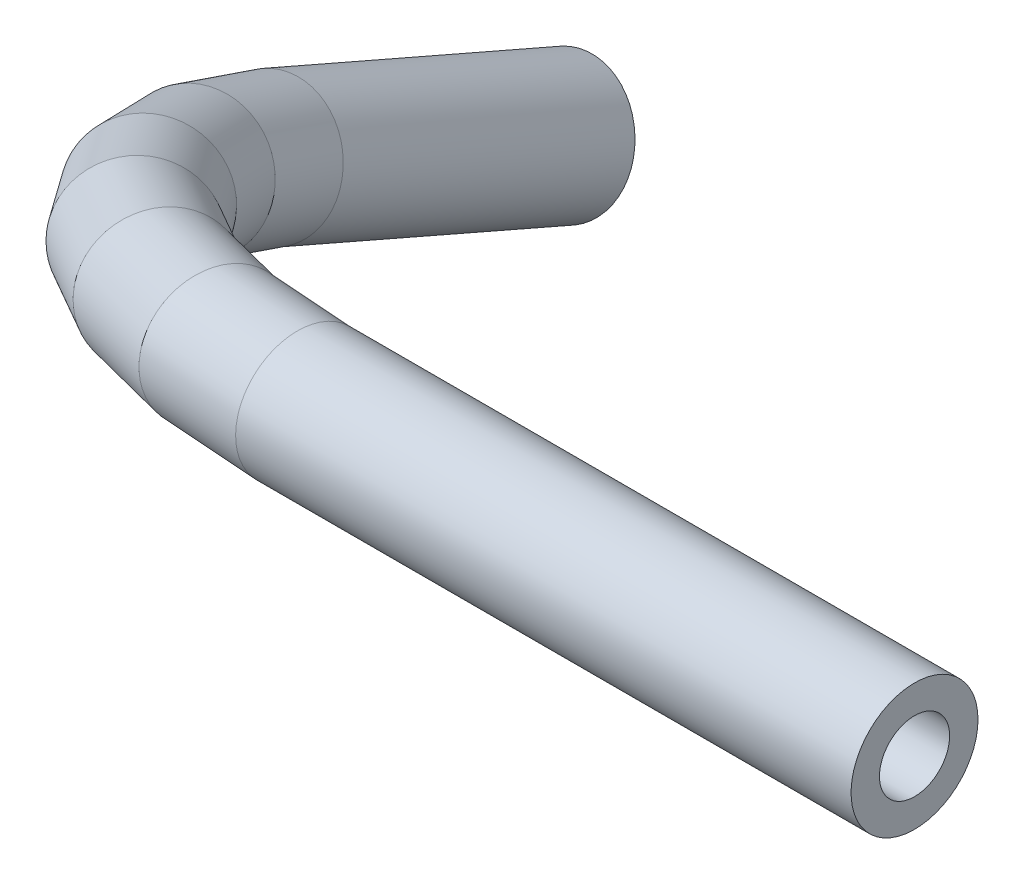
ISO-10303-21;
HEADER;
FILE_DESCRIPTION(('STEP AP214'),'2;1');
FILE_NAME('part.step','',(''),(''),'','','');
FILE_SCHEMA(('AUTOMOTIVE_DESIGN { 1 0 10303 214 1 1 1 1 }'));
ENDSEC;
DATA;
#1=APPLICATION_CONTEXT('core data for automotive mechanical design processes');
#2=APPLICATION_PROTOCOL_DEFINITION('international standard','automotive_design',2000,#1);
#3=PRODUCT_CONTEXT('',#1,'mechanical');
#4=PRODUCT('Part','Part','',(#3));
#5=PRODUCT_RELATED_PRODUCT_CATEGORY('part','',(#4));
#6=PRODUCT_DEFINITION_FORMATION('','',#4);
#7=PRODUCT_DEFINITION_CONTEXT('part definition',#1,'design');
#8=PRODUCT_DEFINITION('design','',#6,#7);
#9=PRODUCT_DEFINITION_SHAPE('','',#8);
#10=(LENGTH_UNIT() NAMED_UNIT(*) SI_UNIT(.MILLI.,.METRE.));
#11=(NAMED_UNIT(*) PLANE_ANGLE_UNIT() SI_UNIT($,.RADIAN.));
#12=(NAMED_UNIT(*) SI_UNIT($,.STERADIAN.) SOLID_ANGLE_UNIT());
#13=UNCERTAINTY_MEASURE_WITH_UNIT(LENGTH_MEASURE(1.E-05),#10,'distance_accuracy_value','');
#14=(GEOMETRIC_REPRESENTATION_CONTEXT(3) GLOBAL_UNCERTAINTY_ASSIGNED_CONTEXT((#13)) GLOBAL_UNIT_ASSIGNED_CONTEXT((#10,
#11,#12)) REPRESENTATION_CONTEXT('',''));
#15=CARTESIAN_POINT('',(0.,0.,0.));
#16=DIRECTION('',(0.,0.,1.));
#17=DIRECTION('',(1.,0.,0.));
#18=AXIS2_PLACEMENT_3D('',#15,#16,#17);
#19=CARTESIAN_POINT('',(-54.,-16.6729544898825,14.0776126132178));
#20=DIRECTION('',(0.,-0.399073615510942,-0.916918889217048));
#21=DIRECTION('',(0.,0.916918889217048,-0.399073615510942));
#22=AXIS2_PLACEMENT_3D('',#19,#20,#21);
#23=CYLINDRICAL_SURFACE('',#22,1.5875);
#24=CARTESIAN_POINT('',(-54.,-16.791199347354,13.8059310508335));
#25=DIRECTION('',(-0.0654031292301432,-0.398219168266685,-0.91495569549126));
#26=DIRECTION('',(-0.997858923238604,0.0261006632476112,0.0599693646050182));
#27=AXIS2_PLACEMENT_3D('',#24,#25,#26);
#28=ELLIPSE('',#27,1.59090625240659,1.5875);
#29=CARTESIAN_POINT('',(-55.5875,-16.7496756390014,13.9013366879364));
#30=VERTEX_POINT('',#29);
#31=EDGE_CURVE('E45',#30,#30,#28,.T.);
#32=ORIENTED_EDGE('',*,*,#31,.T.);
#33=EDGE_LOOP('',(#32));
#34=FACE_BOUND('',#33,.T.);
#35=CARTESIAN_POINT('',(-54.,-20.0064846914234,6.41843222451934));
#36=DIRECTION('',(0.,0.399073615510942,0.916918889217048));
#37=DIRECTION('',(0.916918889217048,0.365918136250125,-0.159259750596976));
#38=AXIS2_PLACEMENT_3D('',#35,#36,#37);
#39=CIRCLE('',#38,1.5875);
#40=CARTESIAN_POINT('',(-52.5443912633679,-19.4255896501263,6.16560737044664));
#41=VERTEX_POINT('',#40);
#42=EDGE_CURVE('E80',#41,#41,#39,.T.);
#43=ORIENTED_EDGE('',*,*,#42,.T.);
#44=EDGE_LOOP('',(#43));
#45=FACE_BOUND('',#44,.T.);
#46=ADVANCED_FACE('F39',(#34,#45),#23,.T.);
#47=CARTESIAN_POINT('',(-53.6117774839006,-15.6143940002341,16.5097806910165));
#48=DIRECTION('',(-0.130526192220052,-0.395659485408191,-0.909074521010824));
#49=DIRECTION('',(0.,0.916918889217048,-0.399073615510942));
#50=AXIS2_PLACEMENT_3D('',#47,#48,#49);
#51=CYLINDRICAL_SURFACE('',#50,1.5875);
#52=CARTESIAN_POINT('',(-53.6762953497461,-15.8099647524785,16.0604337285978));
#53=DIRECTION('',(-0.25881904510252,-0.385475511812573,-0.885675635707032));
#54=DIRECTION('',(-0.965925826289068,0.103287852092148,0.237316071343622));
#55=AXIS2_PLACEMENT_3D('',#52,#53,#54);
#56=ELLIPSE('',#55,1.60119847492099,1.5875);
#57=CARTESIAN_POINT('',(-55.222934309687,-15.6445804012307,16.4404238601075));
#58=VERTEX_POINT('',#57);
#59=EDGE_CURVE('E94',#58,#58,#56,.T.);
#60=ORIENTED_EDGE('',*,*,#59,.T.);
#61=EDGE_LOOP('',(#60));
#62=FACE_BOUND('',#61,.T.);
#63=ORIENTED_EDGE('',*,*,#31,.F.);
#64=EDGE_LOOP('',(#63));
#65=FACE_BOUND('',#64,.T.);
#66=ADVANCED_FACE('F103',(#62,#65),#51,.T.);
#67=CARTESIAN_POINT('',(-52.5380845243522,-14.7133567450021,18.5800204841252));
#68=DIRECTION('',(-0.382683432365089,-0.368695945335839,-0.847122594720615));
#69=DIRECTION('',(-0.911325423031459,0.,0.411686741754615));
#70=AXIS2_PLACEMENT_3D('',#67,#68,#69);
#71=CYLINDRICAL_SURFACE('',#70,1.5875);
#72=CARTESIAN_POINT('',(-52.7272413359522,-14.895599673677,18.1612957746144));
#73=DIRECTION('',(-0.5,-0.34560788901258,-0.794075051271773));
#74=DIRECTION('',(-0.866025403784439,0.199536807755472,0.458459444608523));
#75=AXIS2_PLACEMENT_3D('',#72,#73,#74);
#76=ELLIPSE('',#75,1.60119847492099,1.5875);
#77=CARTESIAN_POINT('',(-54.1139198917346,-14.5761016414083,18.8953803381347));
#78=VERTEX_POINT('',#77);
#79=EDGE_CURVE('E95',#78,#78,#76,.T.);
#80=ORIENTED_EDGE('',*,*,#79,.T.);
#81=EDGE_LOOP('',(#80));
#82=FACE_BOUND('',#81,.T.);
#83=ORIENTED_EDGE('',*,*,#59,.F.);
#84=EDGE_LOOP('',(#83));
#85=FACE_BOUND('',#84,.T.);
#86=ADVANCED_FACE('F104',(#82,#85),#71,.T.);
#87=CARTESIAN_POINT('',(-50.9166093880319,-13.9539210293231,20.3249139719109));
#88=DIRECTION('',(-0.608761429008721,-0.316606385887706,-0.727440663536474));
#89=DIRECTION('',(-0.766891876618844,0.,0.641776323633108));
#90=AXIS2_PLACEMENT_3D('',#87,#88,#89);
#91=CYLINDRICAL_SURFACE('',#90,1.5875);
#92=CARTESIAN_POINT('',(-51.2175144212722,-14.11041658001,19.9653469122859));
#93=DIRECTION('',(-0.707106781186547,-0.282187659720421,-0.648359564363411));
#94=DIRECTION('',(-0.707106781186548,0.282187659720417,0.648359564363413));
#95=AXIS2_PLACEMENT_3D('',#92,#93,#94);
#96=ELLIPSE('',#95,1.60119847492099,1.5875);
#97=CARTESIAN_POINT('',(-52.3497327209144,-13.6585781296241,21.003499257945));
#98=VERTEX_POINT('',#97);
#99=EDGE_CURVE('E90',#98,#98,#96,.T.);
#100=ORIENTED_EDGE('',*,*,#99,.T.);
#101=EDGE_LOOP('',(#100));
#102=FACE_BOUND('',#101,.T.);
#103=ORIENTED_EDGE('',*,*,#79,.F.);
#104=EDGE_LOOP('',(#103));
#105=FACE_BOUND('',#104,.T.);
#106=ADVANCED_FACE('F109',(#102,#105),#91,.T.);
#107=CARTESIAN_POINT('',(-48.8578529258656,-13.3878411421938,21.6255495467538));
#108=DIRECTION('',(-0.793353340291235,-0.242940624458119,-0.558184853284858));
#109=DIRECTION('',(-0.575423885126455,0.,0.817855337101847));
#110=AXIS2_PLACEMENT_3D('',#107,#108,#109);
#111=CYLINDRICAL_SURFACE('',#110,1.5875);
#112=CARTESIAN_POINT('',(-49.25,-13.5079244017344,21.3496440379153));
#113=DIRECTION('',(-0.866025403784439,-0.199536807755471,-0.458459444608524));
#114=DIRECTION('',(-0.5,0.345607889012584,0.794075051271771));
#115=AXIS2_PLACEMENT_3D('',#112,#113,#114);
#116=ELLIPSE('',#115,1.60119847492099,1.5875);
#117=CARTESIAN_POINT('',(-50.0505992374605,-12.9545375769268,22.6211157989845));
#118=VERTEX_POINT('',#117);
#119=EDGE_CURVE('E88',#118,#118,#116,.T.);
#120=ORIENTED_EDGE('',*,*,#119,.T.);
#121=EDGE_LOOP('',(#120));
#122=FACE_BOUND('',#121,.T.);
#123=ORIENTED_EDGE('',*,*,#99,.F.);
#124=EDGE_LOOP('',(#123));
#125=FACE_BOUND('',#124,.T.);
#126=ADVANCED_FACE('F169',(#122,#125),#111,.T.);
#127=CARTESIAN_POINT('',(-46.502115988494,-13.0536944924308,22.3932910436303));
#128=DIRECTION('',(-0.923879532511287,-0.152718860950073,-0.350889667725965));
#129=DIRECTION('',(-0.355054573447479,0.,0.934845575415549));
#130=AXIS2_PLACEMENT_3D('',#127,#128,#129);
#131=CYLINDRICAL_SURFACE('',#130,1.5875);
#132=CARTESIAN_POINT('',(-46.9587809284739,-13.1291819851345,22.2198495900502));
#133=DIRECTION('',(-0.965925826289068,-0.103287852092153,-0.23731607134362));
#134=DIRECTION('',(-0.258819045102521,0.385475511812569,0.885675635707033));
#135=AXIS2_PLACEMENT_3D('',#132,#133,#134);
#136=ELLIPSE('',#135,1.60119847492099,1.5875);
#137=CARTESIAN_POINT('',(-47.3732015887726,-12.5119591835008,23.637992067219));
#138=VERTEX_POINT('',#137);
#139=EDGE_CURVE('E84',#138,#138,#136,.T.);
#140=ORIENTED_EDGE('',*,*,#139,.T.);
#141=EDGE_LOOP('',(#140));
#142=FACE_BOUND('',#141,.T.);
#143=ORIENTED_EDGE('',*,*,#119,.F.);
#144=EDGE_LOOP('',(#143));
#145=FACE_BOUND('',#144,.T.);
#146=ADVANCED_FACE('F163',(#142,#145),#131,.T.);
#147=CARTESIAN_POINT('',(-44.2062365143486,-12.9845659490046,22.5521220582298));
#148=DIRECTION('',(-0.99144486137381,-0.0520895594481328,-0.11968193118414));
#149=DIRECTION('',(-0.119844630170805,0.,0.99279265943057));
#150=AXIS2_PLACEMENT_3D('',#147,#148,#149);
#151=CYLINDRICAL_SURFACE('',#150,1.5875);
#152=CARTESIAN_POINT('',(-44.5,-13.,22.5166604983954));
#153=DIRECTION('',(-0.997858923238603,-0.0261006632476029,-0.0599693646050217));
#154=DIRECTION('',(-0.0654031292301431,0.39821916826669,0.914955695491258));
#155=AXIS2_PLACEMENT_3D('',#152,#153,#154);
#156=ELLIPSE('',#155,1.59090625240659,1.5875);
#157=CARTESIAN_POINT('',(-44.6040502472192,-12.3664706353764,23.9722692350275));
#158=VERTEX_POINT('',#157);
#159=EDGE_CURVE('E78',#158,#158,#156,.T.);
#160=ORIENTED_EDGE('',*,*,#159,.T.);
#161=EDGE_LOOP('',(#160));
#162=FACE_BOUND('',#161,.T.);
#163=ORIENTED_EDGE('',*,*,#139,.F.);
#164=EDGE_LOOP('',(#163));
#165=FACE_BOUND('',#164,.T.);
#166=ADVANCED_FACE('F159',(#162,#165),#151,.T.);
#167=CARTESIAN_POINT('',(-29.2,-13.,22.5166604983954));
#168=DIRECTION('',(-1.,0.,0.));
#169=DIRECTION('',(0.,0.,1.));
#170=AXIS2_PLACEMENT_3D('',#167,#168,#169);
#171=CYLINDRICAL_SURFACE('',#170,1.5875);
#172=CARTESIAN_POINT('',(-29.2,-13.,22.5166604983954));
#173=DIRECTION('',(1.,0.,0.));
#174=DIRECTION('',(0.,0.,-1.));
#175=AXIS2_PLACEMENT_3D('',#172,#173,#174);
#176=CIRCLE('',#175,1.5875);
#177=CARTESIAN_POINT('',(-29.2,-13.,20.9291604983954));
#178=VERTEX_POINT('',#177);
#179=EDGE_CURVE('E74',#178,#178,#176,.T.);
#180=ORIENTED_EDGE('',*,*,#179,.F.);
#181=EDGE_LOOP('',(#180));
#182=FACE_BOUND('',#181,.T.);
#183=ORIENTED_EDGE('',*,*,#159,.F.);
#184=EDGE_LOOP('',(#183));
#185=FACE_BOUND('',#184,.T.);
#186=ADVANCED_FACE('F156',(#182,#185),#171,.T.);
#187=CARTESIAN_POINT('',(-54.,-20.0064846914234,6.41843222451934));
#188=DIRECTION('',(0.,0.399073615510942,0.916918889217048));
#189=DIRECTION('',(0.916918889217048,0.365918136250125,-0.159259750596976));
#190=AXIS2_PLACEMENT_3D('',#187,#188,#189);
#191=PLANE('',#190);
#192=CARTESIAN_POINT('',(-54.,-20.0064846914234,6.41843222451934));
#193=DIRECTION('',(0.,0.399073615510942,0.916918889217048));
#194=DIRECTION('',(0.916918889217048,0.365918136250125,-0.159259750596976));
#195=AXIS2_PLACEMENT_3D('',#192,#193,#194);
#196=CIRCLE('',#195,0.8775);
#197=CARTESIAN_POINT('',(-53.195403674712,-19.6853915268639,6.2786817933705));
#198=VERTEX_POINT('',#197);
#199=EDGE_CURVE('E72',#198,#198,#196,.F.);
#200=ORIENTED_EDGE('',*,*,#199,.F.);
#201=EDGE_LOOP('',(#200));
#202=FACE_BOUND('',#201,.T.);
#203=ORIENTED_EDGE('',*,*,#42,.F.);
#204=EDGE_LOOP('',(#203));
#205=FACE_BOUND('',#204,.T.);
#206=ADVANCED_FACE('F155',(#202,#205),#191,.F.);
#207=CARTESIAN_POINT('',(-29.2,-13.,22.5166604983954));
#208=DIRECTION('',(1.,0.,0.));
#209=DIRECTION('',(0.,0.,-1.));
#210=AXIS2_PLACEMENT_3D('',#207,#208,#209);
#211=PLANE('',#210);
#212=CARTESIAN_POINT('',(-29.2,-13.,22.5166604983954));
#213=DIRECTION('',(1.,0.,0.));
#214=DIRECTION('',(0.,0.,-1.));
#215=AXIS2_PLACEMENT_3D('',#212,#213,#214);
#216=CIRCLE('',#215,0.8775);
#217=CARTESIAN_POINT('',(-29.2,-13.,21.6391604983954));
#218=VERTEX_POINT('',#217);
#219=EDGE_CURVE('E46',#218,#218,#216,.F.);
#220=ORIENTED_EDGE('',*,*,#219,.T.);
#221=EDGE_LOOP('',(#220));
#222=FACE_BOUND('',#221,.T.);
#223=ORIENTED_EDGE('',*,*,#179,.T.);
#224=EDGE_LOOP('',(#223));
#225=FACE_BOUND('',#224,.T.);
#226=ADVANCED_FACE('F146',(#222,#225),#211,.T.);
#227=CARTESIAN_POINT('',(-54.,-16.7113846242518,13.9893148286769));
#228=DIRECTION('',(0.,-0.399073615510942,-0.916918889217048));
#229=DIRECTION('',(0.,0.916918889217048,-0.399073615510942));
#230=AXIS2_PLACEMENT_3D('',#227,#228,#229);
#231=CYLINDRICAL_SURFACE('',#230,0.8775);
#232=CARTESIAN_POINT('',(-54.,-16.791199347354,13.8059310508335));
#233=DIRECTION('',(-0.0654031292301432,-0.398219168266685,-0.91495569549126));
#234=DIRECTION('',(-0.997858923238603,0.0261006632476104,0.0599693646050185));
#235=AXIS2_PLACEMENT_3D('',#232,#233,#234);
#236=ELLIPSE('',#235,0.879382826133405,0.8775);
#237=CARTESIAN_POINT('',(-54.8775,-16.7682468723433,13.8586670801612));
#238=VERTEX_POINT('',#237);
#239=EDGE_CURVE('E69',#238,#238,#236,.F.);
#240=ORIENTED_EDGE('',*,*,#239,.T.);
#241=EDGE_LOOP('',(#240));
#242=FACE_BOUND('',#241,.T.);
#243=ORIENTED_EDGE('',*,*,#199,.T.);
#244=EDGE_LOOP('',(#243));
#245=FACE_BOUND('',#244,.T.);
#246=ADVANCED_FACE('F145',(#242,#245),#231,.F.);
#247=CARTESIAN_POINT('',(-53.6347950115244,-15.6841662274023,16.3494707367957));
#248=DIRECTION('',(-0.130526192220052,-0.395659485408191,-0.909074521010824));
#249=DIRECTION('',(0.,0.916918889217048,-0.399073615510942));
#250=AXIS2_PLACEMENT_3D('',#247,#248,#249);
#251=CYLINDRICAL_SURFACE('',#250,0.8775);
#252=CARTESIAN_POINT('',(-53.6762953497461,-15.8099647524785,16.0604337285978));
#253=DIRECTION('',(-0.25881904510252,-0.385475511812573,-0.885675635707032));
#254=DIRECTION('',(-0.965925826289068,0.103287852092148,0.237316071343622));
#255=AXIS2_PLACEMENT_3D('',#252,#253,#254);
#256=ELLIPSE('',#255,0.885071912909084,0.8775);
#257=CARTESIAN_POINT('',(-54.5312091685481,-15.718547575647,16.270475517826));
#258=VERTEX_POINT('',#257);
#259=EDGE_CURVE('E63',#258,#258,#256,.F.);
#260=ORIENTED_EDGE('',*,*,#259,.T.);
#261=EDGE_LOOP('',(#260));
#262=FACE_BOUND('',#261,.T.);
#263=ORIENTED_EDGE('',*,*,#239,.F.);
#264=EDGE_LOOP('',(#263));
#265=FACE_BOUND('',#264,.T.);
#266=ADVANCED_FACE('F138',(#262,#265),#251,.F.);
#267=CARTESIAN_POINT('',(-52.6055685007541,-14.7783741101929,18.4306353883598));
#268=DIRECTION('',(-0.382683432365089,-0.368695945335839,-0.847122594720615));
#269=DIRECTION('',(-0.911325423031459,0.,0.411686741754615));
#270=AXIS2_PLACEMENT_3D('',#267,#268,#269);
#271=CYLINDRICAL_SURFACE('',#270,0.8775);
#272=CARTESIAN_POINT('',(-52.7272413359522,-14.895599673677,18.1612957746144));
#273=DIRECTION('',(-0.5,-0.34560788901258,-0.794075051271773));
#274=DIRECTION('',(-0.866025403784439,0.199536807755473,0.458459444608523));
#275=AXIS2_PLACEMENT_3D('',#272,#273,#274);
#276=ELLIPSE('',#275,0.885071912909084,0.8775);
#277=CARTESIAN_POINT('',(-53.4937360967075,-14.7189952495411,18.5670653522453));
#278=VERTEX_POINT('',#277);
#279=EDGE_CURVE('E65',#278,#278,#276,.F.);
#280=ORIENTED_EDGE('',*,*,#279,.T.);
#281=EDGE_LOOP('',(#280));
#282=FACE_BOUND('',#281,.T.);
#283=ORIENTED_EDGE('',*,*,#259,.F.);
#284=EDGE_LOOP('',(#283));
#285=FACE_BOUND('',#284,.T.);
#286=ADVANCED_FACE('F137',(#282,#285),#271,.F.);
#287=CARTESIAN_POINT('',(-51.0239608917428,-14.0097527065449,20.1966340820069));
#288=DIRECTION('',(-0.608761429008721,-0.316606385887706,-0.727440663536474));
#289=DIRECTION('',(-0.766891876618844,0.,0.641776323633108));
#290=AXIS2_PLACEMENT_3D('',#287,#288,#289);
#291=CYLINDRICAL_SURFACE('',#290,0.8775);
#292=CARTESIAN_POINT('',(-51.2175144212722,-14.11041658001,19.9653469122859));
#293=DIRECTION('',(-0.707106781186547,-0.282187659720421,-0.648359564363411));
#294=DIRECTION('',(-0.707106781186548,0.282187659720417,0.648359564363413));
#295=AXIS2_PLACEMENT_3D('',#292,#293,#294);
#296=ELLIPSE('',#295,0.885071912909084,0.8775);
#297=CARTESIAN_POINT('',(-51.843354772728,-13.8606602082219,20.5391917521699));
#298=VERTEX_POINT('',#297);
#299=EDGE_CURVE('E56',#298,#298,#296,.F.);
#300=ORIENTED_EDGE('',*,*,#299,.T.);
#301=EDGE_LOOP('',(#300));
#302=FACE_BOUND('',#301,.T.);
#303=ORIENTED_EDGE('',*,*,#279,.F.);
#304=EDGE_LOOP('',(#303));
#305=FACE_BOUND('',#304,.T.);
#306=ADVANCED_FACE('F135',(#302,#305),#291,.F.);
#307=CARTESIAN_POINT('',(-48.9977561293142,-13.4306822949102,21.5271169252155));
#308=DIRECTION('',(-0.793353340291235,-0.242940624458119,-0.558184853284858));
#309=DIRECTION('',(-0.575423885126455,0.,0.817855337101847));
#310=AXIS2_PLACEMENT_3D('',#307,#308,#309);
#311=CYLINDRICAL_SURFACE('',#310,0.8775);
#312=CARTESIAN_POINT('',(-49.25,-13.5079244017344,21.3496440379153));
#313=DIRECTION('',(-0.866025403784439,-0.199536807755471,-0.458459444608524));
#314=DIRECTION('',(-0.5,0.345607889012585,0.794075051271771));
#315=AXIS2_PLACEMENT_3D('',#312,#313,#314);
#316=ELLIPSE('',#315,0.885071912909084,0.8775);
#317=CARTESIAN_POINT('',(-49.6925359564545,-13.2020365662896,22.0524575625378));
#318=VERTEX_POINT('',#317);
#319=EDGE_CURVE('E57',#318,#318,#316,.F.);
#320=ORIENTED_EDGE('',*,*,#319,.T.);
#321=EDGE_LOOP('',(#320));
#322=FACE_BOUND('',#321,.T.);
#323=ORIENTED_EDGE('',*,*,#299,.F.);
#324=EDGE_LOOP('',(#323));
#325=FACE_BOUND('',#324,.T.);
#326=ADVANCED_FACE('F126',(#322,#325),#311,.F.);
#327=CARTESIAN_POINT('',(-46.6650367195664,-13.0806255668826,22.3314137109479));
#328=DIRECTION('',(-0.923879532511287,-0.152718860950073,-0.350889667725965));
#329=DIRECTION('',(-0.355054573447479,0.,0.934845575415549));
#330=AXIS2_PLACEMENT_3D('',#327,#328,#329);
#331=CYLINDRICAL_SURFACE('',#330,0.8775);
#332=CARTESIAN_POINT('',(-46.9587809284739,-13.1291819851345,22.2198495900503));
#333=DIRECTION('',(-0.965925826289068,-0.103287852092153,-0.23731607134362));
#334=DIRECTION('',(-0.258819045102521,0.385475511812569,0.885675635707033));
#335=AXIS2_PLACEMENT_3D('',#332,#333,#334);
#336=ELLIPSE('',#335,0.885071912909084,0.8775);
#337=CARTESIAN_POINT('',(-47.1878543958201,-12.788008436515,23.0037362191624));
#338=VERTEX_POINT('',#337);
#339=EDGE_CURVE('E51',#338,#338,#336,.F.);
#340=ORIENTED_EDGE('',*,*,#339,.T.);
#341=EDGE_LOOP('',(#340));
#342=FACE_BOUND('',#341,.T.);
#343=ORIENTED_EDGE('',*,*,#319,.F.);
#344=EDGE_LOOP('',(#343));
#345=FACE_BOUND('',#344,.T.);
#346=ADVANCED_FACE('F122',(#342,#345),#331,.F.);
#347=CARTESIAN_POINT('',(-44.3017110277252,-12.9895820881104,22.5405968846322));
#348=DIRECTION('',(-0.99144486137381,-0.0520895594481328,-0.11968193118414));
#349=DIRECTION('',(-0.119844630170805,0.,0.99279265943057));
#350=AXIS2_PLACEMENT_3D('',#347,#348,#349);
#351=CYLINDRICAL_SURFACE('',#350,0.8775);
#352=CARTESIAN_POINT('',(-44.5,-13.,22.5166604983954));
#353=DIRECTION('',(-0.997858923238603,-0.0261006632476029,-0.0599693646050217));
#354=DIRECTION('',(-0.0654031292301431,0.39821916826669,0.914955695491258));
#355=AXIS2_PLACEMENT_3D('',#352,#353,#354);
#356=ELLIPSE('',#355,0.879382826133405,0.8775);
#357=CARTESIAN_POINT('',(-44.5575143886204,-12.6498129023891,23.3212568236834));
#358=VERTEX_POINT('',#357);
#359=EDGE_CURVE('E10',#358,#358,#356,.F.);
#360=ORIENTED_EDGE('',*,*,#359,.T.);
#361=EDGE_LOOP('',(#360));
#362=FACE_BOUND('',#361,.T.);
#363=ORIENTED_EDGE('',*,*,#339,.F.);
#364=EDGE_LOOP('',(#363));
#365=FACE_BOUND('',#364,.T.);
#366=ADVANCED_FACE('F113',(#362,#365),#351,.F.);
#367=CARTESIAN_POINT('',(-29.2,-13.,22.5166604983954));
#368=DIRECTION('',(-1.,0.,0.));
#369=DIRECTION('',(0.,0.,1.));
#370=AXIS2_PLACEMENT_3D('',#367,#368,#369);
#371=CYLINDRICAL_SURFACE('',#370,0.8775);
#372=ORIENTED_EDGE('',*,*,#219,.F.);
#373=EDGE_LOOP('',(#372));
#374=FACE_BOUND('',#373,.T.);
#375=ORIENTED_EDGE('',*,*,#359,.F.);
#376=EDGE_LOOP('',(#375));
#377=FACE_BOUND('',#376,.T.);
#378=ADVANCED_FACE('F114',(#374,#377),#371,.F.);
#379=CLOSED_SHELL('',(#46,#66,#86,#106,#126,#146,#166,#186,#206,#226,#246,#266,#286,#306,#326,
#346,#366,#378));
#380=MANIFOLD_SOLID_BREP('B2',#379);
#381=ADVANCED_BREP_SHAPE_REPRESENTATION('',(#18,#380),#14);
#382=SHAPE_DEFINITION_REPRESENTATION(#9,#381);
ENDSEC;
END-ISO-10303-21;
